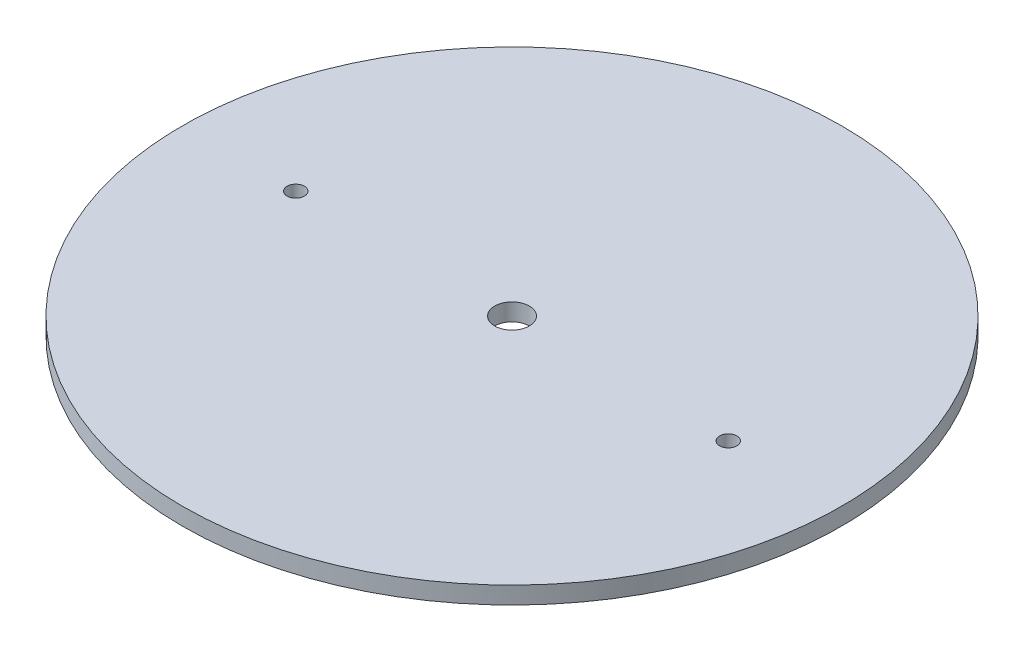
ISO-10303-21;
HEADER;
FILE_DESCRIPTION(('STEP AP214'),'2;1');
FILE_NAME('part.step','',(''),(''),'','','');
FILE_SCHEMA(('AUTOMOTIVE_DESIGN { 1 0 10303 214 1 1 1 1 }'));
ENDSEC;
DATA;
#1=APPLICATION_CONTEXT('core data for automotive mechanical design processes');
#2=APPLICATION_PROTOCOL_DEFINITION('international standard','automotive_design',2000,#1);
#3=PRODUCT_CONTEXT('',#1,'mechanical');
#4=PRODUCT('Part','Part','',(#3));
#5=PRODUCT_RELATED_PRODUCT_CATEGORY('part','',(#4));
#6=PRODUCT_DEFINITION_FORMATION('','',#4);
#7=PRODUCT_DEFINITION_CONTEXT('part definition',#1,'design');
#8=PRODUCT_DEFINITION('design','',#6,#7);
#9=PRODUCT_DEFINITION_SHAPE('','',#8);
#10=(LENGTH_UNIT() NAMED_UNIT(*) SI_UNIT(.MILLI.,.METRE.));
#11=(NAMED_UNIT(*) PLANE_ANGLE_UNIT() SI_UNIT($,.RADIAN.));
#12=(NAMED_UNIT(*) SI_UNIT($,.STERADIAN.) SOLID_ANGLE_UNIT());
#13=UNCERTAINTY_MEASURE_WITH_UNIT(LENGTH_MEASURE(1.E-05),#10,'distance_accuracy_value','');
#14=(GEOMETRIC_REPRESENTATION_CONTEXT(3) GLOBAL_UNCERTAINTY_ASSIGNED_CONTEXT((#13)) GLOBAL_UNIT_ASSIGNED_CONTEXT((#10,
#11,#12)) REPRESENTATION_CONTEXT('',''));
#15=CARTESIAN_POINT('',(0.,0.,0.));
#16=DIRECTION('',(0.,0.,1.));
#17=DIRECTION('',(1.,0.,0.));
#18=AXIS2_PLACEMENT_3D('',#15,#16,#17);
#19=CARTESIAN_POINT('',(0.,4.,0.));
#20=DIRECTION('',(0.,1.,0.));
#21=DIRECTION('',(0.,0.,1.));
#22=AXIS2_PLACEMENT_3D('',#19,#20,#21);
#23=PLANE('',#22);
#24=CARTESIAN_POINT('',(-50.,4.,0.));
#25=DIRECTION('',(0.,1.,0.));
#26=DIRECTION('',(0.,0.,1.));
#27=AXIS2_PLACEMENT_3D('',#24,#25,#26);
#28=CIRCLE('',#27,2.);
#29=CARTESIAN_POINT('',(-50.,4.,2.00000000000001));
#30=VERTEX_POINT('',#29);
#31=EDGE_CURVE('E47',#30,#30,#28,.T.);
#32=ORIENTED_EDGE('',*,*,#31,.F.);
#33=EDGE_LOOP('',(#32));
#34=FACE_BOUND('',#33,.T.);
#35=CARTESIAN_POINT('',(0.,4.,0.));
#36=DIRECTION('',(0.,1.,0.));
#37=DIRECTION('',(0.,0.,1.));
#38=AXIS2_PLACEMENT_3D('',#35,#36,#37);
#39=CIRCLE('',#38,76.2);
#40=CARTESIAN_POINT('',(0.,4.,76.2));
#41=VERTEX_POINT('',#40);
#42=EDGE_CURVE('E10',#41,#41,#39,.T.);
#43=ORIENTED_EDGE('',*,*,#42,.T.);
#44=EDGE_LOOP('',(#43));
#45=FACE_BOUND('',#44,.T.);
#46=CARTESIAN_POINT('',(0.,4.,0.));
#47=DIRECTION('',(0.,1.,0.));
#48=DIRECTION('',(0.,0.,1.));
#49=AXIS2_PLACEMENT_3D('',#46,#47,#48);
#50=CIRCLE('',#49,4.);
#51=CARTESIAN_POINT('',(0.,4.,4.));
#52=VERTEX_POINT('',#51);
#53=EDGE_CURVE('E42',#52,#52,#50,.T.);
#54=ORIENTED_EDGE('',*,*,#53,.F.);
#55=EDGE_LOOP('',(#54));
#56=FACE_BOUND('',#55,.T.);
#57=CARTESIAN_POINT('',(50.,4.,0.));
#58=DIRECTION('',(0.,1.,0.));
#59=DIRECTION('',(0.,0.,-1.));
#60=AXIS2_PLACEMENT_3D('',#57,#58,#59);
#61=CIRCLE('',#60,2.);
#62=CARTESIAN_POINT('',(50.,4.,-2.));
#63=VERTEX_POINT('',#62);
#64=EDGE_CURVE('E53',#63,#63,#61,.T.);
#65=ORIENTED_EDGE('',*,*,#64,.F.);
#66=EDGE_LOOP('',(#65));
#67=FACE_BOUND('',#66,.T.);
#68=ADVANCED_FACE('F31',(#34,#45,#56,#67),#23,.T.);
#69=CARTESIAN_POINT('',(0.,0.,0.));
#70=DIRECTION('',(0.,1.,0.));
#71=DIRECTION('',(0.,0.,1.));
#72=AXIS2_PLACEMENT_3D('',#69,#70,#71);
#73=PLANE('',#72);
#74=CARTESIAN_POINT('',(0.,0.,0.));
#75=DIRECTION('',(0.,1.,0.));
#76=DIRECTION('',(0.,0.,1.));
#77=AXIS2_PLACEMENT_3D('',#74,#75,#76);
#78=CIRCLE('',#77,76.2);
#79=CARTESIAN_POINT('',(0.,0.,76.2));
#80=VERTEX_POINT('',#79);
#81=EDGE_CURVE('E35',#80,#80,#78,.T.);
#82=ORIENTED_EDGE('',*,*,#81,.F.);
#83=EDGE_LOOP('',(#82));
#84=FACE_BOUND('',#83,.T.);
#85=CARTESIAN_POINT('',(0.,0.,0.));
#86=DIRECTION('',(0.,1.,0.));
#87=DIRECTION('',(0.,0.,1.));
#88=AXIS2_PLACEMENT_3D('',#85,#86,#87);
#89=CIRCLE('',#88,4.);
#90=CARTESIAN_POINT('',(0.,0.,4.));
#91=VERTEX_POINT('',#90);
#92=EDGE_CURVE('E44',#91,#91,#89,.T.);
#93=ORIENTED_EDGE('',*,*,#92,.T.);
#94=EDGE_LOOP('',(#93));
#95=FACE_BOUND('',#94,.T.);
#96=CARTESIAN_POINT('',(-50.,0.,0.));
#97=DIRECTION('',(0.,1.,0.));
#98=DIRECTION('',(0.,0.,1.));
#99=AXIS2_PLACEMENT_3D('',#96,#97,#98);
#100=CIRCLE('',#99,2.);
#101=CARTESIAN_POINT('',(-50.,0.,2.00000000000001));
#102=VERTEX_POINT('',#101);
#103=EDGE_CURVE('E50',#102,#102,#100,.T.);
#104=ORIENTED_EDGE('',*,*,#103,.T.);
#105=EDGE_LOOP('',(#104));
#106=FACE_BOUND('',#105,.T.);
#107=CARTESIAN_POINT('',(50.,0.,0.));
#108=DIRECTION('',(0.,1.,0.));
#109=DIRECTION('',(0.,0.,-1.));
#110=AXIS2_PLACEMENT_3D('',#107,#108,#109);
#111=CIRCLE('',#110,2.);
#112=CARTESIAN_POINT('',(50.,0.,-2.));
#113=VERTEX_POINT('',#112);
#114=EDGE_CURVE('E56',#113,#113,#111,.T.);
#115=ORIENTED_EDGE('',*,*,#114,.T.);
#116=EDGE_LOOP('',(#115));
#117=FACE_BOUND('',#116,.T.);
#118=ADVANCED_FACE('F66',(#84,#95,#106,#117),#73,.F.);
#119=CARTESIAN_POINT('',(0.,4.,0.));
#120=DIRECTION('',(0.,-1.,0.));
#121=DIRECTION('',(0.,0.,-1.));
#122=AXIS2_PLACEMENT_3D('',#119,#120,#121);
#123=CYLINDRICAL_SURFACE('',#122,76.2);
#124=ORIENTED_EDGE('',*,*,#42,.F.);
#125=EDGE_LOOP('',(#124));
#126=FACE_BOUND('',#125,.T.);
#127=ORIENTED_EDGE('',*,*,#81,.T.);
#128=EDGE_LOOP('',(#127));
#129=FACE_BOUND('',#128,.T.);
#130=ADVANCED_FACE('F33',(#126,#129),#123,.T.);
#131=CARTESIAN_POINT('',(0.,4.,0.));
#132=DIRECTION('',(0.,-1.,0.));
#133=DIRECTION('',(0.,0.,-1.));
#134=AXIS2_PLACEMENT_3D('',#131,#132,#133);
#135=CYLINDRICAL_SURFACE('',#134,4.);
#136=ORIENTED_EDGE('',*,*,#53,.T.);
#137=EDGE_LOOP('',(#136));
#138=FACE_BOUND('',#137,.T.);
#139=ORIENTED_EDGE('',*,*,#92,.F.);
#140=EDGE_LOOP('',(#139));
#141=FACE_BOUND('',#140,.T.);
#142=ADVANCED_FACE('F75',(#138,#141),#135,.F.);
#143=CARTESIAN_POINT('',(-50.,4.,0.));
#144=DIRECTION('',(0.,-1.,0.));
#145=DIRECTION('',(0.,0.,-1.));
#146=AXIS2_PLACEMENT_3D('',#143,#144,#145);
#147=CYLINDRICAL_SURFACE('',#146,2.);
#148=ORIENTED_EDGE('',*,*,#31,.T.);
#149=EDGE_LOOP('',(#148));
#150=FACE_BOUND('',#149,.T.);
#151=ORIENTED_EDGE('',*,*,#103,.F.);
#152=EDGE_LOOP('',(#151));
#153=FACE_BOUND('',#152,.T.);
#154=ADVANCED_FACE('F78',(#150,#153),#147,.F.);
#155=CARTESIAN_POINT('',(50.,4.,0.));
#156=DIRECTION('',(0.,-1.,0.));
#157=DIRECTION('',(0.,0.,-1.));
#158=AXIS2_PLACEMENT_3D('',#155,#156,#157);
#159=CYLINDRICAL_SURFACE('',#158,2.);
#160=ORIENTED_EDGE('',*,*,#64,.T.);
#161=EDGE_LOOP('',(#160));
#162=FACE_BOUND('',#161,.T.);
#163=ORIENTED_EDGE('',*,*,#114,.F.);
#164=EDGE_LOOP('',(#163));
#165=FACE_BOUND('',#164,.T.);
#166=ADVANCED_FACE('F62',(#162,#165),#159,.F.);
#167=CLOSED_SHELL('',(#68,#118,#130,#142,#154,#166));
#168=MANIFOLD_SOLID_BREP('B2',#167);
#169=ADVANCED_BREP_SHAPE_REPRESENTATION('',(#18,#168),#14);
#170=SHAPE_DEFINITION_REPRESENTATION(#9,#169);
ENDSEC;
END-ISO-10303-21;
